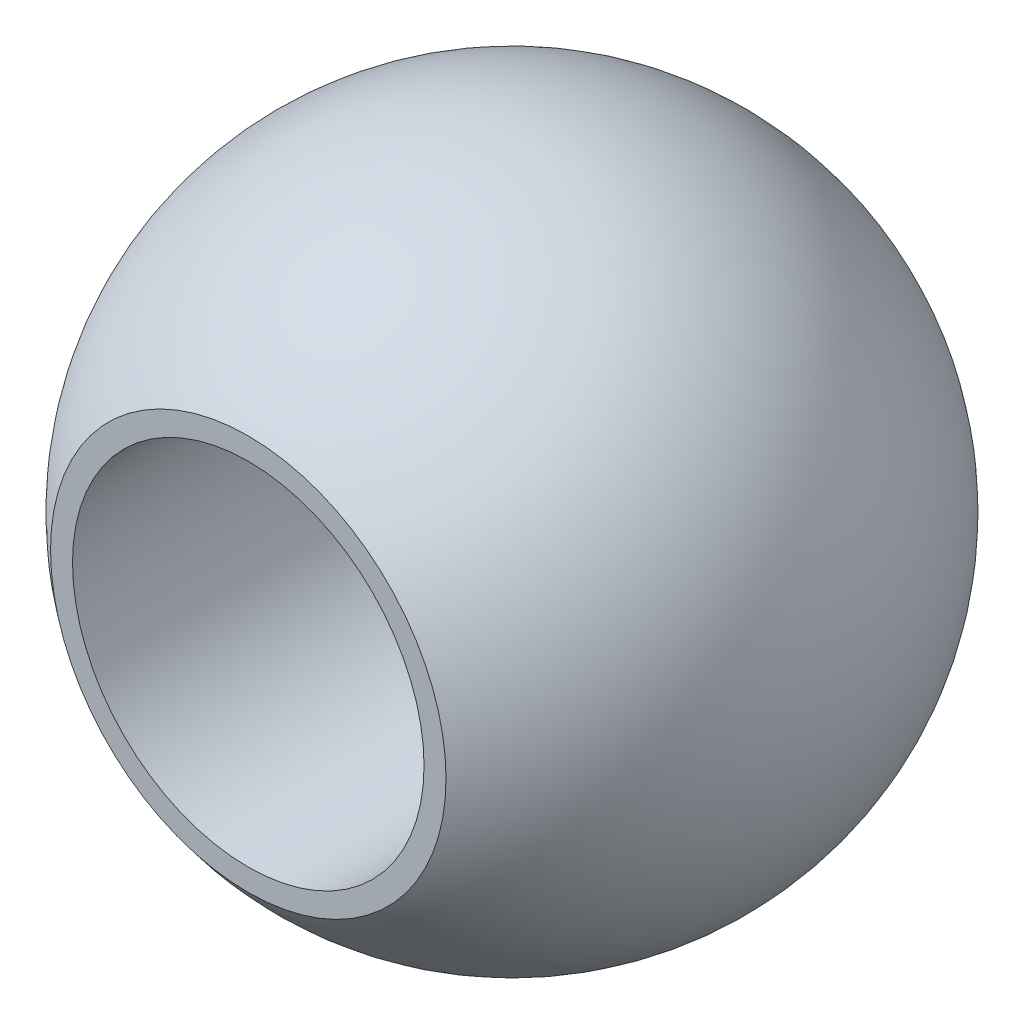
ISO-10303-21;
HEADER;
FILE_DESCRIPTION(('STEP AP214'),'2;1');
FILE_NAME('part.step','',(''),(''),'','','');
FILE_SCHEMA(('AUTOMOTIVE_DESIGN { 1 0 10303 214 1 1 1 1 }'));
ENDSEC;
DATA;
#1=APPLICATION_CONTEXT('core data for automotive mechanical design processes');
#2=APPLICATION_PROTOCOL_DEFINITION('international standard','automotive_design',2000,#1);
#3=PRODUCT_CONTEXT('',#1,'mechanical');
#4=PRODUCT('Part','Part','',(#3));
#5=PRODUCT_RELATED_PRODUCT_CATEGORY('part','',(#4));
#6=PRODUCT_DEFINITION_FORMATION('','',#4);
#7=PRODUCT_DEFINITION_CONTEXT('part definition',#1,'design');
#8=PRODUCT_DEFINITION('design','',#6,#7);
#9=PRODUCT_DEFINITION_SHAPE('','',#8);
#10=(LENGTH_UNIT() NAMED_UNIT(*) SI_UNIT(.MILLI.,.METRE.));
#11=(NAMED_UNIT(*) PLANE_ANGLE_UNIT() SI_UNIT($,.RADIAN.));
#12=(NAMED_UNIT(*) SI_UNIT($,.STERADIAN.) SOLID_ANGLE_UNIT());
#13=UNCERTAINTY_MEASURE_WITH_UNIT(LENGTH_MEASURE(1.E-05),#10,'distance_accuracy_value','');
#14=(GEOMETRIC_REPRESENTATION_CONTEXT(3) GLOBAL_UNCERTAINTY_ASSIGNED_CONTEXT((#13)) GLOBAL_UNIT_ASSIGNED_CONTEXT((#10,
#11,#12)) REPRESENTATION_CONTEXT('',''));
#15=CARTESIAN_POINT('',(0.,0.,0.));
#16=DIRECTION('',(0.,0.,1.));
#17=DIRECTION('',(1.,0.,0.));
#18=AXIS2_PLACEMENT_3D('',#15,#16,#17);
#19=CARTESIAN_POINT('',(0.,0.,0.));
#20=DIRECTION('',(0.,0.,-1.));
#21=DIRECTION('',(1.,0.,0.));
#22=AXIS2_PLACEMENT_3D('',#19,#20,#21);
#23=SPHERICAL_SURFACE('',#22,7.50000000000001);
#24=CARTESIAN_POINT('',(0.,0.,-6.));
#25=DIRECTION('',(0.,0.,-1.));
#26=DIRECTION('',(-1.,0.,0.));
#27=AXIS2_PLACEMENT_3D('',#24,#25,#26);
#28=CIRCLE('',#27,4.5);
#29=CARTESIAN_POINT('',(4.5,0.,-6.));
#30=VERTEX_POINT('',#29);
#31=EDGE_CURVE('E44',#30,#30,#28,.T.);
#32=CARTESIAN_POINT('',(0.,0.,6.));
#33=DIRECTION('',(0.,0.,-1.));
#34=DIRECTION('',(-1.,0.,0.));
#35=AXIS2_PLACEMENT_3D('',#32,#33,#34);
#36=CIRCLE('',#35,4.5);
#37=CARTESIAN_POINT('',(4.5,0.,6.));
#38=VERTEX_POINT('',#37);
#39=EDGE_CURVE('E10',#38,#38,#36,.T.);
#40=CARTESIAN_POINT('',(4.5,0.,-6.));
#41=CARTESIAN_POINT('',(4.6159151632725,0.,-5.91306994755985));
#42=CARTESIAN_POINT('',(4.7293047912831,0.,-5.82277336161192));
#43=CARTESIAN_POINT('',(4.95066656712378,0.,-5.63576731774261));
#44=CARTESIAN_POINT('',(5.05863871495386,0.,-5.53905785982123));
#45=CARTESIAN_POINT('',(5.26879912077681,0.,-5.33954626704718));
#46=CARTESIAN_POINT('',(5.37098737876967,0.,-5.23674413219451));
#47=CARTESIAN_POINT('',(5.56923789172215,0.,-5.02539360956729));
#48=CARTESIAN_POINT('',(5.66530014668177,0.,-4.91684522179275));
#49=CARTESIAN_POINT('',(5.85097580509613,0.,-4.69436636689376));
#50=CARTESIAN_POINT('',(5.94058920855088,0.,-4.58043589976931));
#51=CARTESIAN_POINT('',(6.11306632038763,0.,-4.34757554677857));
#52=CARTESIAN_POINT('',(6.19593002876964,0.,-4.22864566091227));
#53=CARTESIAN_POINT('',(6.35462947827263,0.,-3.98618580785145));
#54=CARTESIAN_POINT('',(6.43046521939361,0.,-3.86265584065694));
#55=CARTESIAN_POINT('',(6.57485408689096,0.,-3.61141063894985));
#56=CARTESIAN_POINT('',(6.64340721326733,0.,-3.48369540443727));
#57=CARTESIAN_POINT('',(6.7730006517314,0.,-3.22450852806209));
#58=CARTESIAN_POINT('',(6.83404096381911,0.,-3.09303688619949));
#59=CARTESIAN_POINT('',(6.94840380363705,0.,-2.82677867106409));
#60=CARTESIAN_POINT('',(7.00172633136729,0.,-2.69199209779128));
#61=CARTESIAN_POINT('',(7.10047454786904,0.,-2.4195566265843));
#62=CARTESIAN_POINT('',(7.14590023664055,0.,-2.28190772865013));
#63=CARTESIAN_POINT('',(7.22870223796085,0.,-2.00420982657195));
#64=CARTESIAN_POINT('',(7.26607855050963,0.,-1.86416082242794));
#65=CARTESIAN_POINT('',(7.33265629150631,0.,-1.58213298578247));
#66=CARTESIAN_POINT('',(7.36185771995421,0.,-1.44015415328101));
#67=CARTESIAN_POINT('',(7.41198763575031,0.,-1.15474341805537));
#68=CARTESIAN_POINT('',(7.43291612309851,0.,-1.0113115153312));
#69=CARTESIAN_POINT('',(7.46642987983461,0.,-0.723476277132294));
#70=CARTESIAN_POINT('',(7.47901514922252,0.,-0.579072941657565));
#71=CARTESIAN_POINT('',(7.49580020930521,0.,-0.289779737455223));
#72=CARTESIAN_POINT('',(7.49999999999999,0.,-0.144889868727611));
#73=CARTESIAN_POINT('',(7.49999999999999,0.,0.144889868727613));
#74=CARTESIAN_POINT('',(7.49580020930521,0.,0.289779737455225));
#75=CARTESIAN_POINT('',(7.47901514922252,0.,0.579072941657567));
#76=CARTESIAN_POINT('',(7.46642987983461,0.,0.723476277132296));
#77=CARTESIAN_POINT('',(7.43291612309851,0.,1.0113115153312));
#78=CARTESIAN_POINT('',(7.41198763575031,0.,1.15474341805537));
#79=CARTESIAN_POINT('',(7.36185771995421,0.,1.44015415328101));
#80=CARTESIAN_POINT('',(7.33265629150631,0.,1.58213298578247));
#81=CARTESIAN_POINT('',(7.26607855050963,0.,1.86416082242795));
#82=CARTESIAN_POINT('',(7.22870223796085,0.,2.00420982657195));
#83=CARTESIAN_POINT('',(7.14590023664055,0.,2.28190772865013));
#84=CARTESIAN_POINT('',(7.10047454786904,0.,2.41955662658431));
#85=CARTESIAN_POINT('',(7.00172633136729,0.,2.69199209779128));
#86=CARTESIAN_POINT('',(6.94840380363705,0.,2.82677867106409));
#87=CARTESIAN_POINT('',(6.83404096381911,0.,3.09303688619949));
#88=CARTESIAN_POINT('',(6.7730006517314,0.,3.2245085280621));
#89=CARTESIAN_POINT('',(6.64340721326733,0.,3.48369540443727));
#90=CARTESIAN_POINT('',(6.57485408689095,0.,3.61141063894985));
#91=CARTESIAN_POINT('',(6.43046521939361,0.,3.86265584065694));
#92=CARTESIAN_POINT('',(6.35462947827263,0.,3.98618580785145));
#93=CARTESIAN_POINT('',(6.19593002876964,0.,4.22864566091227));
#94=CARTESIAN_POINT('',(6.11306632038763,0.,4.34757554677857));
#95=CARTESIAN_POINT('',(5.94058920855088,0.,4.58043589976931));
#96=CARTESIAN_POINT('',(5.85097580509613,0.,4.69436636689376));
#97=CARTESIAN_POINT('',(5.66530014668177,0.,4.91684522179275));
#98=CARTESIAN_POINT('',(5.56923789172215,0.,5.02539360956729));
#99=CARTESIAN_POINT('',(5.37098737876967,0.,5.23674413219451));
#100=CARTESIAN_POINT('',(5.26879912077681,0.,5.33954626704718));
#101=CARTESIAN_POINT('',(5.05863871495386,0.,5.53905785982123));
#102=CARTESIAN_POINT('',(4.95066656712378,0.,5.63576731774261));
#103=CARTESIAN_POINT('',(4.7293047912831,0.,5.82277336161192));
#104=CARTESIAN_POINT('',(4.6159151632725,0.,5.91306994755985));
#105=CARTESIAN_POINT('',(4.5,0.,6.));
#106=B_SPLINE_CURVE_WITH_KNOTS('',3,(#40,#41,#42,#43,#44,#45,#46,#47,#48,#49,#50,#51,#52,#53,
#54,#55,#56,#57,#58,#59,#60,#61,#62,#63,#64,#65,#66,#67,#68,#69,#70,#71,#72,#73,#74,#75,#76,#77,
#78,#79,#80,#81,#82,#83,#84,#85,#86,#87,#88,#89,#90,#91,#92,#93,#94,#95,#96,#97,#98,#99,#100,
#101,#102,#103,#104,#105),.UNSPECIFIED.,.F.,.F.,(4,2,2,2,2,2,2,2,2,2,2,2,2,2,2,2,2,2,2,2,2,2,2,
2,2,2,2,2,2,2,2,2,4),(0.,0.434608802306038,0.869217604612077,1.30382640691812,1.73843520922416,
2.17304401153019,2.60765281383623,3.04226161614227,3.47687041844831,3.91147922075435,
4.34608802306039,4.78069682536643,5.21530562767247,5.64991442997851,6.08452323228454,
6.51913203459058,6.95374083689662,7.38834963920266,7.8229584415087,8.25756724381474,
8.69217604612078,9.12678484842682,9.56139365073285,9.99600245303889,10.4306112553449,
10.865220057651,11.299828859957,11.734437662263,12.1690464645691,12.6036552668751,
13.0382640691812,13.4728728714872,13.9074816737932),.UNSPECIFIED.);
#107=EDGE_CURVE('BSEAM30',#30,#38,#106,.T.);
#108=ORIENTED_EDGE('',*,*,#31,.F.);
#109=ORIENTED_EDGE('',*,*,#39,.T.);
#110=ORIENTED_EDGE('',*,*,#107,.T.);
#111=ORIENTED_EDGE('',*,*,#107,.F.);
#112=EDGE_LOOP('',(#108,#110,#109,#111));
#113=FACE_BOUND('',#112,.T.);
#114=ADVANCED_FACE('F30',(#113),#23,.T.);
#115=CARTESIAN_POINT('',(4.5,0.,6.));
#116=DIRECTION('',(0.,0.,-1.));
#117=DIRECTION('',(-1.,0.,0.));
#118=AXIS2_PLACEMENT_3D('',#115,#116,#117);
#119=PLANE('',#118);
#120=ORIENTED_EDGE('',*,*,#39,.F.);
#121=EDGE_LOOP('',(#120));
#122=FACE_BOUND('',#121,.T.);
#123=CARTESIAN_POINT('',(0.,0.,6.));
#124=DIRECTION('',(0.,0.,-1.));
#125=DIRECTION('',(-1.,0.,0.));
#126=AXIS2_PLACEMENT_3D('',#123,#124,#125);
#127=CIRCLE('',#126,4.);
#128=CARTESIAN_POINT('',(-4.,0.,6.));
#129=VERTEX_POINT('',#128);
#130=EDGE_CURVE('E36',#129,#129,#127,.T.);
#131=ORIENTED_EDGE('',*,*,#130,.T.);
#132=EDGE_LOOP('',(#131));
#133=FACE_BOUND('',#132,.T.);
#134=ADVANCED_FACE('F53',(#122,#133),#119,.F.);
#135=CARTESIAN_POINT('',(0.,0.,-7.5));
#136=DIRECTION('',(0.,0.,-1.));
#137=DIRECTION('',(-1.,0.,0.));
#138=AXIS2_PLACEMENT_3D('',#135,#136,#137);
#139=CYLINDRICAL_SURFACE('',#138,4.);
#140=ORIENTED_EDGE('',*,*,#130,.F.);
#141=EDGE_LOOP('',(#140));
#142=FACE_BOUND('',#141,.T.);
#143=CARTESIAN_POINT('',(0.,0.,-6.));
#144=DIRECTION('',(0.,0.,-1.));
#145=DIRECTION('',(-1.,0.,0.));
#146=AXIS2_PLACEMENT_3D('',#143,#144,#145);
#147=CIRCLE('',#146,4.);
#148=CARTESIAN_POINT('',(-4.,0.,-6.));
#149=VERTEX_POINT('',#148);
#150=EDGE_CURVE('E40',#149,#149,#147,.T.);
#151=ORIENTED_EDGE('',*,*,#150,.T.);
#152=EDGE_LOOP('',(#151));
#153=FACE_BOUND('',#152,.T.);
#154=ADVANCED_FACE('F57',(#142,#153),#139,.F.);
#155=CARTESIAN_POINT('',(4.,0.,-6.));
#156=DIRECTION('',(0.,0.,1.));
#157=DIRECTION('',(1.,0.,0.));
#158=AXIS2_PLACEMENT_3D('',#155,#156,#157);
#159=PLANE('',#158);
#160=ORIENTED_EDGE('',*,*,#150,.F.);
#161=EDGE_LOOP('',(#160));
#162=FACE_BOUND('',#161,.T.);
#163=ORIENTED_EDGE('',*,*,#31,.T.);
#164=EDGE_LOOP('',(#163));
#165=FACE_BOUND('',#164,.T.);
#166=ADVANCED_FACE('F50',(#162,#165),#159,.F.);
#167=CLOSED_SHELL('',(#114,#134,#154,#166));
#168=MANIFOLD_SOLID_BREP('B2',#167);
#169=ADVANCED_BREP_SHAPE_REPRESENTATION('',(#18,#168),#14);
#170=SHAPE_DEFINITION_REPRESENTATION(#9,#169);
ENDSEC;
END-ISO-10303-21;
